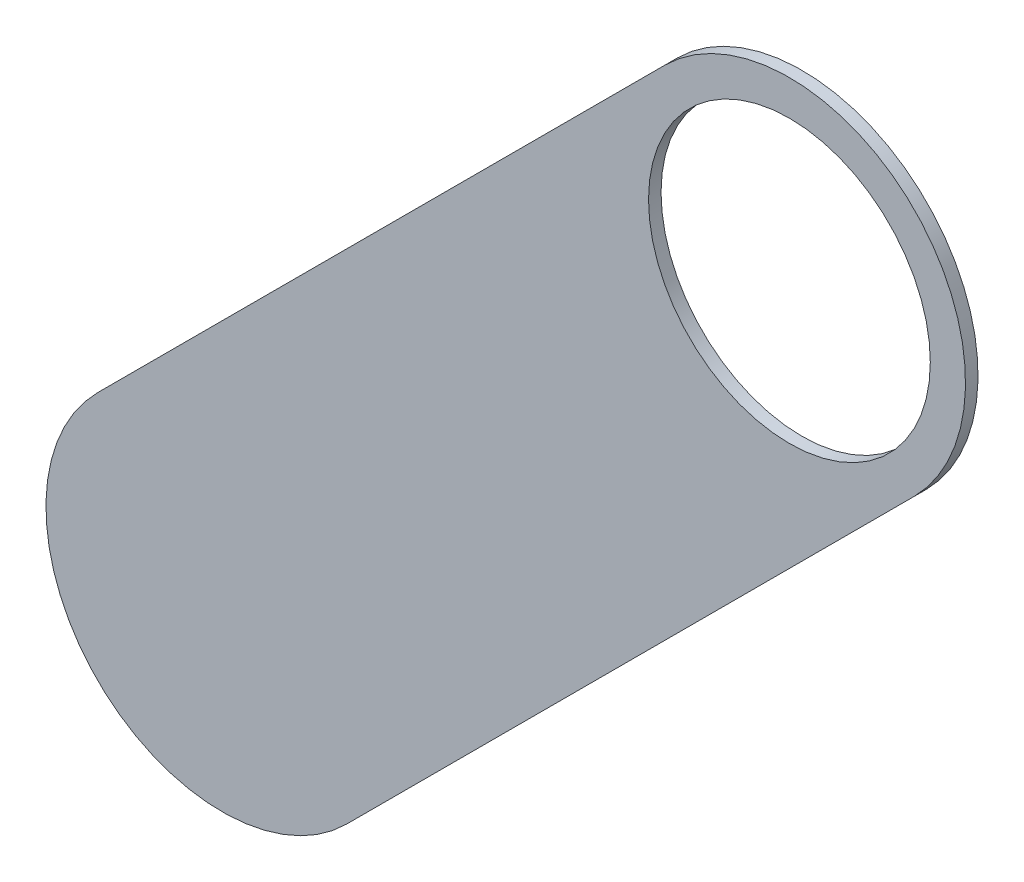
ISO-10303-21;
HEADER;
FILE_DESCRIPTION(('STEP AP214'),'2;1');
FILE_NAME('part.step','',(''),(''),'','','');
FILE_SCHEMA(('AUTOMOTIVE_DESIGN { 1 0 10303 214 1 1 1 1 }'));
ENDSEC;
DATA;
#1=APPLICATION_CONTEXT('core data for automotive mechanical design processes');
#2=APPLICATION_PROTOCOL_DEFINITION('international standard','automotive_design',2000,#1);
#3=PRODUCT_CONTEXT('',#1,'mechanical');
#4=PRODUCT('Part','Part','',(#3));
#5=PRODUCT_RELATED_PRODUCT_CATEGORY('part','',(#4));
#6=PRODUCT_DEFINITION_FORMATION('','',#4);
#7=PRODUCT_DEFINITION_CONTEXT('part definition',#1,'design');
#8=PRODUCT_DEFINITION('design','',#6,#7);
#9=PRODUCT_DEFINITION_SHAPE('','',#8);
#10=(LENGTH_UNIT() NAMED_UNIT(*) SI_UNIT(.MILLI.,.METRE.));
#11=(NAMED_UNIT(*) PLANE_ANGLE_UNIT() SI_UNIT($,.RADIAN.));
#12=(NAMED_UNIT(*) SI_UNIT($,.STERADIAN.) SOLID_ANGLE_UNIT());
#13=UNCERTAINTY_MEASURE_WITH_UNIT(LENGTH_MEASURE(1.E-05),#10,'distance_accuracy_value','');
#14=(GEOMETRIC_REPRESENTATION_CONTEXT(3) GLOBAL_UNCERTAINTY_ASSIGNED_CONTEXT((#13)) GLOBAL_UNIT_ASSIGNED_CONTEXT((#10,
#11,#12)) REPRESENTATION_CONTEXT('',''));
#15=CARTESIAN_POINT('',(0.,0.,0.));
#16=DIRECTION('',(0.,0.,1.));
#17=DIRECTION('',(1.,0.,0.));
#18=AXIS2_PLACEMENT_3D('',#15,#16,#17);
#19=CARTESIAN_POINT('',(76.83295276,102.30583044,0.));
#20=DIRECTION('',(-0.707106781186548,0.707106781186548,0.));
#21=DIRECTION('',(0.707106781186548,0.707106781186548,0.));
#22=AXIS2_PLACEMENT_3D('',#19,#20,#21);
#23=PLANE('',#22);
#24=DIRECTION('',(0.707106781186548,0.707106781186548,0.));
#25=VECTOR('',#24,1.);
#26=CARTESIAN_POINT('',(76.83295276,102.30583044,0.03556));
#27=LINE('',#26,#25);
#28=CARTESIAN_POINT('',(76.83295276,102.30583044,0.03556));
#29=VERTEX_POINT('',#28);
#30=CARTESIAN_POINT('',(78.44356676,103.91644444,0.03556));
#31=VERTEX_POINT('',#30);
#32=EDGE_CURVE('E11',#29,#31,#27,.T.);
#33=ORIENTED_EDGE('',*,*,#32,.F.);
#34=DIRECTION('',(0.,0.,1.));
#35=VECTOR('',#34,1.);
#36=CARTESIAN_POINT('',(76.83295276,102.30583044,0.));
#37=LINE('',#36,#35);
#38=CARTESIAN_POINT('',(76.83295276,102.30583044,0.));
#39=VERTEX_POINT('',#38);
#40=EDGE_CURVE('E24',#39,#29,#37,.T.);
#41=ORIENTED_EDGE('',*,*,#40,.F.);
#42=DIRECTION('',(0.707106781186548,0.707106781186548,0.));
#43=VECTOR('',#42,1.);
#44=CARTESIAN_POINT('',(76.83295276,102.30583044,0.));
#45=LINE('',#44,#43);
#46=CARTESIAN_POINT('',(78.44356676,103.91644444,0.));
#47=VERTEX_POINT('',#46);
#48=EDGE_CURVE('E96',#39,#47,#45,.T.);
#49=ORIENTED_EDGE('',*,*,#48,.T.);
#50=DIRECTION('',(0.,0.,1.));
#51=VECTOR('',#50,1.);
#52=CARTESIAN_POINT('',(78.44356676,103.91644444,0.));
#53=LINE('',#52,#51);
#54=EDGE_CURVE('E37',#47,#31,#53,.T.);
#55=ORIENTED_EDGE('',*,*,#54,.T.);
#56=EDGE_LOOP('',(#33,#41,#49,#55));
#57=FACE_BOUND('',#56,.T.);
#58=ADVANCED_FACE('F17',(#57),#23,.F.);
#59=CARTESIAN_POINT('',(76.4794,102.6593832,0.));
#60=DIRECTION('',(0.,0.,-1.));
#61=DIRECTION('',(-0.707106781186548,0.707106781186548,0.));
#62=AXIS2_PLACEMENT_3D('',#59,#60,#61);
#63=CYLINDRICAL_SURFACE('',#62,0.499999108206439);
#64=CARTESIAN_POINT('',(76.4794,102.6593832,0.03556));
#65=DIRECTION('',(0.,0.,1.));
#66=DIRECTION('',(-0.707106781186548,0.707106781186548,0.));
#67=AXIS2_PLACEMENT_3D('',#64,#65,#66);
#68=CIRCLE('',#67,0.499999108206439);
#69=CARTESIAN_POINT('',(76.12584724,103.01293596,0.03556));
#70=VERTEX_POINT('',#69);
#71=EDGE_CURVE('E92',#70,#29,#68,.T.);
#72=ORIENTED_EDGE('',*,*,#71,.F.);
#73=DIRECTION('',(0.,0.,1.));
#74=VECTOR('',#73,1.);
#75=CARTESIAN_POINT('',(76.12584724,103.01293596,0.));
#76=LINE('',#75,#74);
#77=CARTESIAN_POINT('',(76.12584724,103.01293596,0.));
#78=VERTEX_POINT('',#77);
#79=EDGE_CURVE('E90',#78,#70,#76,.T.);
#80=ORIENTED_EDGE('',*,*,#79,.F.);
#81=CARTESIAN_POINT('',(76.4794,102.6593832,0.));
#82=DIRECTION('',(0.,0.,1.));
#83=DIRECTION('',(-0.707106781186548,0.707106781186548,0.));
#84=AXIS2_PLACEMENT_3D('',#81,#82,#83);
#85=CIRCLE('',#84,0.499999108206439);
#86=EDGE_CURVE('E88',#78,#39,#85,.T.);
#87=ORIENTED_EDGE('',*,*,#86,.T.);
#88=ORIENTED_EDGE('',*,*,#40,.T.);
#89=EDGE_LOOP('',(#72,#80,#87,#88));
#90=FACE_BOUND('',#89,.T.);
#91=ADVANCED_FACE('F111',(#90),#63,.T.);
#92=CARTESIAN_POINT('',(78.090014,104.2699972,0.));
#93=DIRECTION('',(0.,0.,-1.));
#94=DIRECTION('',(0.707106781186548,-0.707106781186548,0.));
#95=AXIS2_PLACEMENT_3D('',#92,#93,#94);
#96=CYLINDRICAL_SURFACE('',#95,0.499999108206439);
#97=CARTESIAN_POINT('',(78.090014,104.2699972,0.03556));
#98=DIRECTION('',(0.,0.,1.));
#99=DIRECTION('',(0.707106781186548,-0.707106781186548,0.));
#100=AXIS2_PLACEMENT_3D('',#97,#98,#99);
#101=CIRCLE('',#100,0.499999108206439);
#102=CARTESIAN_POINT('',(77.73646124,104.62354996,0.03556));
#103=VERTEX_POINT('',#102);
#104=EDGE_CURVE('E85',#31,#103,#101,.T.);
#105=ORIENTED_EDGE('',*,*,#104,.F.);
#106=ORIENTED_EDGE('',*,*,#54,.F.);
#107=CARTESIAN_POINT('',(78.090014,104.2699972,0.));
#108=DIRECTION('',(0.,0.,1.));
#109=DIRECTION('',(0.707106781186548,-0.707106781186548,0.));
#110=AXIS2_PLACEMENT_3D('',#107,#108,#109);
#111=CIRCLE('',#110,0.499999108206439);
#112=CARTESIAN_POINT('',(77.73646124,104.62354996,0.));
#113=VERTEX_POINT('',#112);
#114=EDGE_CURVE('E82',#47,#113,#111,.T.);
#115=ORIENTED_EDGE('',*,*,#114,.T.);
#116=DIRECTION('',(0.,0.,1.));
#117=VECTOR('',#116,1.);
#118=CARTESIAN_POINT('',(77.73646124,104.62354996,0.));
#119=LINE('',#118,#117);
#120=EDGE_CURVE('E80',#113,#103,#119,.T.);
#121=ORIENTED_EDGE('',*,*,#120,.T.);
#122=EDGE_LOOP('',(#105,#106,#115,#121));
#123=FACE_BOUND('',#122,.T.);
#124=ADVANCED_FACE('F104',(#123),#96,.T.);
#125=CARTESIAN_POINT('',(77.73646124,104.62354996,0.));
#126=DIRECTION('',(0.707106781186548,-0.707106781186548,0.));
#127=DIRECTION('',(-0.707106781186548,-0.707106781186548,0.));
#128=AXIS2_PLACEMENT_3D('',#125,#126,#127);
#129=PLANE('',#128);
#130=DIRECTION('',(-0.707106781186548,-0.707106781186548,0.));
#131=VECTOR('',#130,1.);
#132=CARTESIAN_POINT('',(77.73646124,104.62354996,0.03556));
#133=LINE('',#132,#131);
#134=EDGE_CURVE('E77',#103,#70,#133,.T.);
#135=ORIENTED_EDGE('',*,*,#134,.F.);
#136=ORIENTED_EDGE('',*,*,#120,.F.);
#137=DIRECTION('',(-0.707106781186548,-0.707106781186548,0.));
#138=VECTOR('',#137,1.);
#139=CARTESIAN_POINT('',(77.73646124,104.62354996,0.));
#140=LINE('',#139,#138);
#141=EDGE_CURVE('E68',#113,#78,#140,.T.);
#142=ORIENTED_EDGE('',*,*,#141,.T.);
#143=ORIENTED_EDGE('',*,*,#79,.T.);
#144=EDGE_LOOP('',(#135,#136,#142,#143));
#145=FACE_BOUND('',#144,.T.);
#146=ADVANCED_FACE('F110',(#145),#129,.F.);
#147=CARTESIAN_POINT('',(78.090014,104.2699972,0.));
#148=DIRECTION('',(0.,0.,-1.));
#149=DIRECTION('',(1.,0.,0.));
#150=AXIS2_PLACEMENT_3D('',#147,#148,#149);
#151=CYLINDRICAL_SURFACE('',#150,0.3999992);
#152=DIRECTION('',(0.,0.,1.));
#153=VECTOR('',#152,1.);
#154=CARTESIAN_POINT('',(78.4900132,104.2699972,0.));
#155=LINE('',#154,#153);
#156=CARTESIAN_POINT('',(78.4900132,104.2699972,0.));
#157=VERTEX_POINT('',#156);
#158=CARTESIAN_POINT('',(78.4900132,104.2699972,0.03556));
#159=VERTEX_POINT('',#158);
#160=EDGE_CURVE('E62',#157,#159,#155,.T.);
#161=ORIENTED_EDGE('',*,*,#160,.T.);
#162=CARTESIAN_POINT('',(78.090014,104.2699972,0.03556));
#163=DIRECTION('',(0.,0.,1.));
#164=DIRECTION('',(1.,0.,0.));
#165=AXIS2_PLACEMENT_3D('',#162,#163,#164);
#166=CIRCLE('',#165,0.3999992);
#167=EDGE_CURVE('E67',#159,#159,#166,.T.);
#168=ORIENTED_EDGE('',*,*,#167,.T.);
#169=ORIENTED_EDGE('',*,*,#160,.F.);
#170=CARTESIAN_POINT('',(78.090014,104.2699972,0.));
#171=DIRECTION('',(0.,0.,1.));
#172=DIRECTION('',(1.,0.,0.));
#173=AXIS2_PLACEMENT_3D('',#170,#171,#172);
#174=CIRCLE('',#173,0.3999992);
#175=EDGE_CURVE('E65',#157,#157,#174,.T.);
#176=ORIENTED_EDGE('',*,*,#175,.F.);
#177=EDGE_LOOP('',(#161,#168,#169,#176));
#178=FACE_BOUND('',#177,.T.);
#179=ADVANCED_FACE('F64',(#178),#151,.F.);
#180=CARTESIAN_POINT('',(76.83295276,102.30583044,0.));
#181=DIRECTION('',(0.,0.,-1.));
#182=DIRECTION('',(-1.,0.,0.));
#183=AXIS2_PLACEMENT_3D('',#180,#181,#182);
#184=PLANE('',#183);
#185=ORIENTED_EDGE('',*,*,#48,.F.);
#186=ORIENTED_EDGE('',*,*,#86,.F.);
#187=ORIENTED_EDGE('',*,*,#141,.F.);
#188=ORIENTED_EDGE('',*,*,#114,.F.);
#189=EDGE_LOOP('',(#185,#186,#187,#188));
#190=FACE_BOUND('',#189,.T.);
#191=ORIENTED_EDGE('',*,*,#175,.T.);
#192=EDGE_LOOP('',(#191));
#193=FACE_BOUND('',#192,.T.);
#194=ADVANCED_FACE('F71',(#190,#193),#184,.T.);
#195=CARTESIAN_POINT('',(76.83295276,102.30583044,0.03556));
#196=DIRECTION('',(0.,0.,-1.));
#197=DIRECTION('',(-1.,0.,0.));
#198=AXIS2_PLACEMENT_3D('',#195,#196,#197);
#199=PLANE('',#198);
#200=ORIENTED_EDGE('',*,*,#134,.T.);
#201=ORIENTED_EDGE('',*,*,#71,.T.);
#202=ORIENTED_EDGE('',*,*,#32,.T.);
#203=ORIENTED_EDGE('',*,*,#104,.T.);
#204=EDGE_LOOP('',(#200,#201,#202,#203));
#205=FACE_BOUND('',#204,.T.);
#206=ORIENTED_EDGE('',*,*,#167,.F.);
#207=EDGE_LOOP('',(#206));
#208=FACE_BOUND('',#207,.T.);
#209=ADVANCED_FACE('F107',(#205,#208),#199,.F.);
#210=CLOSED_SHELL('',(#58,#91,#124,#146,#179,#194,#209));
#211=MANIFOLD_SOLID_BREP('B1',#210);
#212=ADVANCED_BREP_SHAPE_REPRESENTATION('',(#18,#211),#14);
#213=SHAPE_DEFINITION_REPRESENTATION(#9,#212);
ENDSEC;
END-ISO-10303-21;
